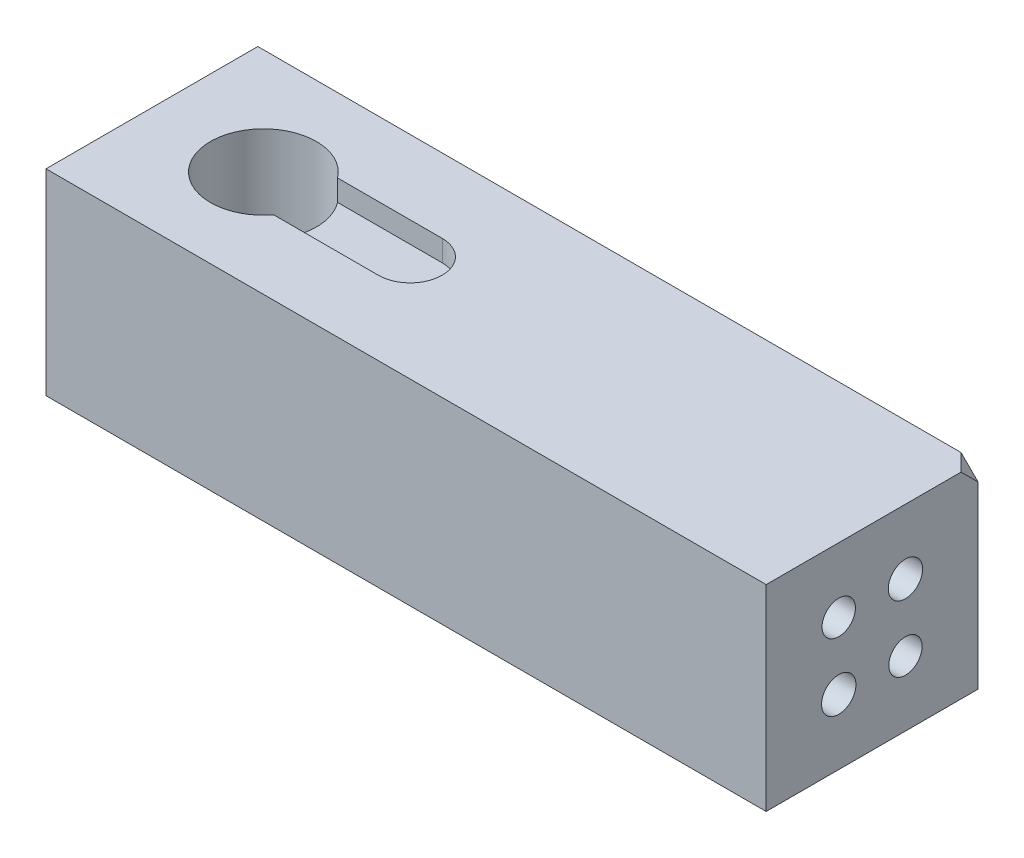
ISO-10303-21;
HEADER;
FILE_DESCRIPTION(('STEP AP214'),'2;1');
FILE_NAME('part.step','',(''),(''),'','','');
FILE_SCHEMA(('AUTOMOTIVE_DESIGN { 1 0 10303 214 1 1 1 1 }'));
ENDSEC;
DATA;
#1=APPLICATION_CONTEXT('core data for automotive mechanical design processes');
#2=APPLICATION_PROTOCOL_DEFINITION('international standard','automotive_design',2000,#1);
#3=PRODUCT_CONTEXT('',#1,'mechanical');
#4=PRODUCT('Part','Part','',(#3));
#5=PRODUCT_RELATED_PRODUCT_CATEGORY('part','',(#4));
#6=PRODUCT_DEFINITION_FORMATION('','',#4);
#7=PRODUCT_DEFINITION_CONTEXT('part definition',#1,'design');
#8=PRODUCT_DEFINITION('design','',#6,#7);
#9=PRODUCT_DEFINITION_SHAPE('','',#8);
#10=(LENGTH_UNIT() NAMED_UNIT(*) SI_UNIT(.MILLI.,.METRE.));
#11=(NAMED_UNIT(*) PLANE_ANGLE_UNIT() SI_UNIT($,.RADIAN.));
#12=(NAMED_UNIT(*) SI_UNIT($,.STERADIAN.) SOLID_ANGLE_UNIT());
#13=UNCERTAINTY_MEASURE_WITH_UNIT(LENGTH_MEASURE(1.E-05),#10,'distance_accuracy_value','');
#14=(GEOMETRIC_REPRESENTATION_CONTEXT(3) GLOBAL_UNCERTAINTY_ASSIGNED_CONTEXT((#13)) GLOBAL_UNIT_ASSIGNED_CONTEXT((#10,
#11,#12)) REPRESENTATION_CONTEXT('',''));
#15=CARTESIAN_POINT('',(0.,0.,0.));
#16=DIRECTION('',(0.,0.,1.));
#17=DIRECTION('',(1.,0.,0.));
#18=AXIS2_PLACEMENT_3D('',#15,#16,#17);
#19=CARTESIAN_POINT('',(0.,25.4,0.));
#20=DIRECTION('',(0.,1.,0.));
#21=DIRECTION('',(0.,0.,1.));
#22=AXIS2_PLACEMENT_3D('',#19,#20,#21);
#23=PLANE('',#22);
#24=DIRECTION('',(-1.,0.,-4.62106884082891E-13));
#25=VECTOR('',#24,1.);
#26=CARTESIAN_POINT('',(-33.9966063376731,25.4,-4.78790000000355));
#27=LINE('',#26,#25);
#28=CARTESIAN_POINT('',(-15.2356983518078,25.4,-4.78789999999488));
#29=VERTEX_POINT('',#28);
#30=CARTESIAN_POINT('',(-30.9323279661511,25.4,-4.78790000000214));
#31=VERTEX_POINT('',#30);
#32=EDGE_CURVE('E530',#29,#31,#27,.T.);
#33=ORIENTED_EDGE('',*,*,#32,.F.);
#34=CARTESIAN_POINT('',(-15.23569835181,25.4,-0.0253999999948824));
#35=DIRECTION('',(0.,1.,0.));
#36=DIRECTION('',(0.,0.,1.));
#37=AXIS2_PLACEMENT_3D('',#34,#35,#36);
#38=CIRCLE('',#37,4.7625);
#39=CARTESIAN_POINT('',(-10.47319835181,25.4,-0.0253999999948826));
#40=VERTEX_POINT('',#39);
#41=EDGE_CURVE('E391',#29,#40,#38,.F.);
#42=ORIENTED_EDGE('',*,*,#41,.T.);
#43=DIRECTION('',(0.,0.,-1.));
#44=VECTOR('',#43,1.);
#45=CARTESIAN_POINT('',(-10.47319835181,25.4,4.78789999999734));
#46=LINE('',#45,#44);
#47=CARTESIAN_POINT('',(-10.47319835181,25.4,0.025399999996005));
#48=VERTEX_POINT('',#47);
#49=EDGE_CURVE('E528',#48,#40,#46,.T.);
#50=ORIENTED_EDGE('',*,*,#49,.F.);
#51=CARTESIAN_POINT('',(-15.23569835181,25.4,0.025399999996005));
#52=DIRECTION('',(0.,1.,0.));
#53=DIRECTION('',(0.,0.,1.));
#54=AXIS2_PLACEMENT_3D('',#51,#52,#53);
#55=CIRCLE('',#54,4.7625);
#56=CARTESIAN_POINT('',(-15.2356983518114,25.4,4.787899999996));
#57=VERTEX_POINT('',#56);
#58=EDGE_CURVE('E522',#48,#57,#55,.F.);
#59=ORIENTED_EDGE('',*,*,#58,.T.);
#60=DIRECTION('',(1.,0.,2.79650172951439E-13));
#61=VECTOR('',#60,1.);
#62=CARTESIAN_POINT('',(-19.9981983518098,25.4,4.78789999999467));
#63=LINE('',#62,#61);
#64=CARTESIAN_POINT('',(-30.9323279661458,25.4,4.78789999999161));
#65=VERTEX_POINT('',#64);
#66=EDGE_CURVE('E536',#65,#57,#63,.T.);
#67=ORIENTED_EDGE('',*,*,#66,.F.);
#68=CARTESIAN_POINT('',(-37.2631983518087,25.4,-1.77635683940025E-12));
#69=DIRECTION('',(0.,1.,0.));
#70=DIRECTION('',(0.,0.,1.));
#71=AXIS2_PLACEMENT_3D('',#68,#69,#70);
#72=CIRCLE('',#71,7.9375);
#73=EDGE_CURVE('E567',#31,#65,#72,.T.);
#74=ORIENTED_EDGE('',*,*,#73,.F.);
#75=EDGE_LOOP('',(#33,#42,#50,#59,#67,#74));
#76=FACE_BOUND('',#75,.T.);
#77=DIRECTION('',(0.,0.,-1.));
#78=VECTOR('',#77,1.);
#79=CARTESIAN_POINT('',(53.975,25.4,-15.875));
#80=LINE('',#79,#78);
#81=CARTESIAN_POINT('',(53.975,25.4,15.875));
#82=VERTEX_POINT('',#81);
#83=CARTESIAN_POINT('',(53.975,25.4,-13.335));
#84=VERTEX_POINT('',#83);
#85=EDGE_CURVE('E472',#82,#84,#80,.T.);
#86=ORIENTED_EDGE('',*,*,#85,.T.);
#87=DIRECTION('',(-0.707106781186548,0.,-0.707106781186547));
#88=VECTOR('',#87,1.);
#89=CARTESIAN_POINT('',(33.655,25.4,-33.655));
#90=LINE('',#89,#88);
#91=CARTESIAN_POINT('',(51.435,25.4,-15.875));
#92=VERTEX_POINT('',#91);
#93=EDGE_CURVE('E66',#84,#92,#90,.T.);
#94=ORIENTED_EDGE('',*,*,#93,.T.);
#95=DIRECTION('',(-1.,0.,0.));
#96=VECTOR('',#95,1.);
#97=CARTESIAN_POINT('',(-53.975,25.4,-15.875));
#98=LINE('',#97,#96);
#99=CARTESIAN_POINT('',(-53.975,25.4,-15.875));
#100=VERTEX_POINT('',#99);
#101=EDGE_CURVE('E479',#92,#100,#98,.T.);
#102=ORIENTED_EDGE('',*,*,#101,.T.);
#103=DIRECTION('',(0.,0.,1.));
#104=VECTOR('',#103,1.);
#105=CARTESIAN_POINT('',(-53.975,25.4,-15.875));
#106=LINE('',#105,#104);
#107=CARTESIAN_POINT('',(-53.975,25.4,15.875));
#108=VERTEX_POINT('',#107);
#109=EDGE_CURVE('E483',#100,#108,#106,.T.);
#110=ORIENTED_EDGE('',*,*,#109,.T.);
#111=DIRECTION('',(1.,0.,0.));
#112=VECTOR('',#111,1.);
#113=CARTESIAN_POINT('',(-53.975,25.4,15.875));
#114=LINE('',#113,#112);
#115=EDGE_CURVE('E477',#108,#82,#114,.T.);
#116=ORIENTED_EDGE('',*,*,#115,.T.);
#117=EDGE_LOOP('',(#86,#94,#102,#110,#116));
#118=FACE_BOUND('',#117,.T.);
#119=ADVANCED_FACE('F370',(#76,#118),#23,.T.);
#120=CARTESIAN_POINT('',(-53.975,25.4,-15.875));
#121=DIRECTION('',(1.,0.,0.));
#122=DIRECTION('',(0.,0.,-1.));
#123=AXIS2_PLACEMENT_3D('',#120,#121,#122);
#124=PLANE('',#123);
#125=DIRECTION('',(0.,-1.,0.));
#126=VECTOR('',#125,1.);
#127=CARTESIAN_POINT('',(-53.975,25.4,-15.875));
#128=LINE('',#127,#126);
#129=CARTESIAN_POINT('',(-53.975,-4.05688234030898,-15.875));
#130=VERTEX_POINT('',#129);
#131=EDGE_CURVE('E481',#100,#130,#128,.T.);
#132=ORIENTED_EDGE('',*,*,#131,.T.);
#133=DIRECTION('',(0.,0.,1.));
#134=VECTOR('',#133,1.);
#135=CARTESIAN_POINT('',(-53.975,-4.05688234030898,-15.875));
#136=LINE('',#135,#134);
#137=CARTESIAN_POINT('',(-53.975,-4.05688234030898,15.875));
#138=VERTEX_POINT('',#137);
#139=EDGE_CURVE('E564',#130,#138,#136,.T.);
#140=ORIENTED_EDGE('',*,*,#139,.T.);
#141=DIRECTION('',(0.,-1.,0.));
#142=VECTOR('',#141,1.);
#143=CARTESIAN_POINT('',(-53.975,25.4,15.875));
#144=LINE('',#143,#142);
#145=EDGE_CURVE('E492',#108,#138,#144,.T.);
#146=ORIENTED_EDGE('',*,*,#145,.F.);
#147=ORIENTED_EDGE('',*,*,#109,.F.);
#148=EDGE_LOOP('',(#132,#140,#146,#147));
#149=FACE_BOUND('',#148,.T.);
#150=ADVANCED_FACE('F573',(#149),#124,.F.);
#151=CARTESIAN_POINT('',(-53.975,25.4,15.875));
#152=DIRECTION('',(0.,0.,-1.));
#153=DIRECTION('',(-1.,0.,0.));
#154=AXIS2_PLACEMENT_3D('',#151,#152,#153);
#155=PLANE('',#154);
#156=DIRECTION('',(1.,0.,0.));
#157=VECTOR('',#156,1.);
#158=CARTESIAN_POINT('',(-53.975,-4.05688234030898,15.875));
#159=LINE('',#158,#157);
#160=CARTESIAN_POINT('',(53.975,-4.05688234030898,15.875));
#161=VERTEX_POINT('',#160);
#162=EDGE_CURVE('E561',#138,#161,#159,.T.);
#163=ORIENTED_EDGE('',*,*,#162,.T.);
#164=DIRECTION('',(0.,-1.,0.));
#165=VECTOR('',#164,1.);
#166=CARTESIAN_POINT('',(53.975,25.4,15.875));
#167=LINE('',#166,#165);
#168=EDGE_CURVE('E490',#82,#161,#167,.T.);
#169=ORIENTED_EDGE('',*,*,#168,.F.);
#170=ORIENTED_EDGE('',*,*,#115,.F.);
#171=ORIENTED_EDGE('',*,*,#145,.T.);
#172=EDGE_LOOP('',(#163,#169,#170,#171));
#173=FACE_BOUND('',#172,.T.);
#174=ADVANCED_FACE('F575',(#173),#155,.F.);
#175=CARTESIAN_POINT('',(53.975,25.4,-15.875));
#176=DIRECTION('',(-1.,0.,0.));
#177=DIRECTION('',(0.,0.,1.));
#178=AXIS2_PLACEMENT_3D('',#175,#176,#177);
#179=PLANE('',#178);
#180=DIRECTION('',(0.,-0.707106781186548,-0.707106781186548));
#181=VECTOR('',#180,1.);
#182=CARTESIAN_POINT('',(53.975,24.13,-14.605));
#183=LINE('',#182,#181);
#184=CARTESIAN_POINT('',(53.975,22.86,-15.875));
#185=VERTEX_POINT('',#184);
#186=EDGE_CURVE('E463',#84,#185,#183,.T.);
#187=ORIENTED_EDGE('',*,*,#186,.F.);
#188=ORIENTED_EDGE('',*,*,#85,.F.);
#189=ORIENTED_EDGE('',*,*,#168,.T.);
#190=DIRECTION('',(0.,0.,1.));
#191=VECTOR('',#190,1.);
#192=CARTESIAN_POINT('',(53.975,-4.05688234030898,-15.875));
#193=LINE('',#192,#191);
#194=CARTESIAN_POINT('',(53.975,-4.05688234030898,-15.875));
#195=VERTEX_POINT('',#194);
#196=EDGE_CURVE('E500',#195,#161,#193,.T.);
#197=ORIENTED_EDGE('',*,*,#196,.F.);
#198=DIRECTION('',(0.,-1.,0.));
#199=VECTOR('',#198,1.);
#200=CARTESIAN_POINT('',(53.975,25.4,-15.875));
#201=LINE('',#200,#199);
#202=EDGE_CURVE('E474',#185,#195,#201,.T.);
#203=ORIENTED_EDGE('',*,*,#202,.F.);
#204=EDGE_LOOP('',(#187,#188,#189,#197,#203));
#205=FACE_BOUND('',#204,.T.);
#206=CARTESIAN_POINT('',(53.975,5.69982153438806,5.));
#207=DIRECTION('',(1.,0.,0.));
#208=DIRECTION('',(0.,0.,-1.));
#209=AXIS2_PLACEMENT_3D('',#206,#207,#208);
#210=CIRCLE('',#209,2.57649999999999);
#211=CARTESIAN_POINT('',(53.975,5.69982153438806,2.42350000000001));
#212=VERTEX_POINT('',#211);
#213=EDGE_CURVE('E841',#212,#212,#210,.T.);
#214=ORIENTED_EDGE('',*,*,#213,.F.);
#215=EDGE_LOOP('',(#214));
#216=FACE_BOUND('',#215,.T.);
#217=CARTESIAN_POINT('',(53.975,15.6998215343881,-5.));
#218=DIRECTION('',(1.,0.,0.));
#219=DIRECTION('',(0.,0.,-1.));
#220=AXIS2_PLACEMENT_3D('',#217,#218,#219);
#221=CIRCLE('',#220,2.57649999999999);
#222=CARTESIAN_POINT('',(53.975,15.6998215343881,-7.57649999999999));
#223=VERTEX_POINT('',#222);
#224=EDGE_CURVE('E835',#223,#223,#221,.T.);
#225=ORIENTED_EDGE('',*,*,#224,.F.);
#226=EDGE_LOOP('',(#225));
#227=FACE_BOUND('',#226,.T.);
#228=CARTESIAN_POINT('',(53.975,15.6998215343881,5.));
#229=DIRECTION('',(1.,0.,0.));
#230=DIRECTION('',(0.,0.,-1.));
#231=AXIS2_PLACEMENT_3D('',#228,#229,#230);
#232=CIRCLE('',#231,2.49999999999999);
#233=CARTESIAN_POINT('',(53.975,15.6998215343881,2.50000000000001));
#234=VERTEX_POINT('',#233);
#235=EDGE_CURVE('E829',#234,#234,#232,.T.);
#236=ORIENTED_EDGE('',*,*,#235,.F.);
#237=EDGE_LOOP('',(#236));
#238=FACE_BOUND('',#237,.T.);
#239=CARTESIAN_POINT('',(53.975,5.69982153438806,-5.));
#240=DIRECTION('',(1.,0.,0.));
#241=DIRECTION('',(0.,0.,-1.));
#242=AXIS2_PLACEMENT_3D('',#239,#240,#241);
#243=CIRCLE('',#242,2.49999999999999);
#244=CARTESIAN_POINT('',(53.975,5.69982153438806,-7.49999999999999));
#245=VERTEX_POINT('',#244);
#246=EDGE_CURVE('E823',#245,#245,#243,.T.);
#247=ORIENTED_EDGE('',*,*,#246,.F.);
#248=EDGE_LOOP('',(#247));
#249=FACE_BOUND('',#248,.T.);
#250=ADVANCED_FACE('F470',(#205,#216,#227,#238,#249),#179,.F.);
#251=CARTESIAN_POINT('',(-53.975,25.4,-15.875));
#252=DIRECTION('',(0.,0.,1.));
#253=DIRECTION('',(1.,0.,0.));
#254=AXIS2_PLACEMENT_3D('',#251,#252,#253);
#255=PLANE('',#254);
#256=DIRECTION('',(-0.707106781186548,0.707106781186547,0.));
#257=VECTOR('',#256,1.);
#258=CARTESIAN_POINT('',(-1.27000000000006,78.105,-15.875));
#259=LINE('',#258,#257);
#260=EDGE_CURVE('E378',#185,#92,#259,.T.);
#261=ORIENTED_EDGE('',*,*,#260,.F.);
#262=ORIENTED_EDGE('',*,*,#202,.T.);
#263=DIRECTION('',(-1.,0.,0.));
#264=VECTOR('',#263,1.);
#265=CARTESIAN_POINT('',(-53.975,-4.05688234030898,-15.875));
#266=LINE('',#265,#264);
#267=EDGE_CURVE('E499',#195,#130,#266,.T.);
#268=ORIENTED_EDGE('',*,*,#267,.T.);
#269=ORIENTED_EDGE('',*,*,#131,.F.);
#270=ORIENTED_EDGE('',*,*,#101,.F.);
#271=EDGE_LOOP('',(#261,#262,#268,#269,#270));
#272=FACE_BOUND('',#271,.T.);
#273=ADVANCED_FACE('F580',(#272),#255,.F.);
#274=CARTESIAN_POINT('',(-37.2631983518087,-12.7,-1.77635683940025E-12));
#275=DIRECTION('',(0.,1.,0.));
#276=DIRECTION('',(0.,0.,1.));
#277=AXIS2_PLACEMENT_3D('',#274,#275,#276);
#278=CYLINDRICAL_SURFACE('',#277,7.9375);
#279=CARTESIAN_POINT('',(-37.2631983518087,-4.05688234030898,-1.77635683940025E-12));
#280=DIRECTION('',(0.,1.,0.));
#281=DIRECTION('',(0.,0.,1.));
#282=AXIS2_PLACEMENT_3D('',#279,#280,#281);
#283=CIRCLE('',#282,7.9375);
#284=CARTESIAN_POINT('',(-37.2631983518087,-4.05688234030898,7.93749999999823));
#285=VERTEX_POINT('',#284);
#286=EDGE_CURVE('E496',#285,#285,#283,.F.);
#287=ORIENTED_EDGE('',*,*,#286,.T.);
#288=EDGE_LOOP('',(#287));
#289=FACE_BOUND('',#288,.T.);
#290=CARTESIAN_POINT('',(-37.2631983518087,22.2250000000039,-1.77635683940025E-12));
#291=DIRECTION('',(0.,-1.,0.));
#292=DIRECTION('',(0.,0.,-1.));
#293=AXIS2_PLACEMENT_3D('',#290,#291,#292);
#294=CIRCLE('',#293,7.9375);
#295=CARTESIAN_POINT('',(-30.9323279661501,22.2250000000039,4.78789999999734));
#296=VERTEX_POINT('',#295);
#297=CARTESIAN_POINT('',(-30.9323279661522,22.2250000000039,-4.78790000000356));
#298=VERTEX_POINT('',#297);
#299=EDGE_CURVE('E495',#296,#298,#294,.F.);
#300=ORIENTED_EDGE('',*,*,#299,.T.);
#301=DIRECTION('',(0.,1.,0.));
#302=VECTOR('',#301,1.);
#303=CARTESIAN_POINT('',(-30.9323279661511,-12.7,-4.78790000000214));
#304=LINE('',#303,#302);
#305=EDGE_CURVE('E506',#298,#31,#304,.T.);
#306=ORIENTED_EDGE('',*,*,#305,.T.);
#307=ORIENTED_EDGE('',*,*,#73,.T.);
#308=DIRECTION('',(0.,1.,0.));
#309=VECTOR('',#308,1.);
#310=CARTESIAN_POINT('',(-30.9323279661458,-12.7,4.78789999999161));
#311=LINE('',#310,#309);
#312=EDGE_CURVE('E503',#65,#296,#311,.F.);
#313=ORIENTED_EDGE('',*,*,#312,.T.);
#314=EDGE_LOOP('',(#300,#306,#307,#313));
#315=FACE_BOUND('',#314,.T.);
#316=ADVANCED_FACE('F582',(#289,#315),#278,.F.);
#317=CARTESIAN_POINT('',(39.8215832278428,-4.05688234030899,71.6580714500799));
#318=DIRECTION('',(0.,1.,0.));
#319=DIRECTION('',(0.,0.,1.));
#320=AXIS2_PLACEMENT_3D('',#317,#318,#319);
#321=PLANE('',#320);
#322=ORIENTED_EDGE('',*,*,#286,.F.);
#323=EDGE_LOOP('',(#322));
#324=FACE_BOUND('',#323,.T.);
#325=ORIENTED_EDGE('',*,*,#139,.F.);
#326=ORIENTED_EDGE('',*,*,#267,.F.);
#327=ORIENTED_EDGE('',*,*,#196,.T.);
#328=ORIENTED_EDGE('',*,*,#162,.F.);
#329=EDGE_LOOP('',(#325,#326,#327,#328));
#330=FACE_BOUND('',#329,.T.);
#331=ADVANCED_FACE('F578',(#324,#330),#321,.F.);
#332=CARTESIAN_POINT('',(-33.9966063376731,22.2250000000039,-4.78790000000355));
#333=DIRECTION('',(4.62106884082891E-13,0.,-1.));
#334=DIRECTION('',(-1.,0.,-4.62106884082891E-13));
#335=AXIS2_PLACEMENT_3D('',#332,#333,#334);
#336=PLANE('',#335);
#337=DIRECTION('',(-1.,0.,0.));
#338=VECTOR('',#337,1.);
#339=CARTESIAN_POINT('',(-19.99819835181,22.2250000000039,-4.78790000000355));
#340=LINE('',#339,#338);
#341=CARTESIAN_POINT('',(-15.2356983518078,22.2250000000039,-4.78790000000355));
#342=VERTEX_POINT('',#341);
#343=EDGE_CURVE('E543',#342,#298,#340,.T.);
#344=ORIENTED_EDGE('',*,*,#343,.F.);
#345=DIRECTION('',(0.,1.,0.));
#346=VECTOR('',#345,1.);
#347=CARTESIAN_POINT('',(-15.2356983518078,25.4,-4.78789999999488));
#348=LINE('',#347,#346);
#349=EDGE_CURVE('E520',#342,#29,#348,.T.);
#350=ORIENTED_EDGE('',*,*,#349,.T.);
#351=ORIENTED_EDGE('',*,*,#32,.T.);
#352=ORIENTED_EDGE('',*,*,#305,.F.);
#353=EDGE_LOOP('',(#344,#350,#351,#352));
#354=FACE_BOUND('',#353,.T.);
#355=ADVANCED_FACE('F547',(#354),#336,.F.);
#356=CARTESIAN_POINT('',(-19.9981983518098,22.2250000000039,4.78789999999467));
#357=DIRECTION('',(-2.79650172951439E-13,0.,1.));
#358=DIRECTION('',(1.,0.,2.79650172951439E-13));
#359=AXIS2_PLACEMENT_3D('',#356,#357,#358);
#360=PLANE('',#359);
#361=ORIENTED_EDGE('',*,*,#66,.T.);
#362=DIRECTION('',(0.,1.,0.));
#363=VECTOR('',#362,1.);
#364=CARTESIAN_POINT('',(-15.2356983518114,22.2250000000039,4.787899999996));
#365=LINE('',#364,#363);
#366=CARTESIAN_POINT('',(-15.2356983518114,22.2250000000039,4.78789999999733));
#367=VERTEX_POINT('',#366);
#368=EDGE_CURVE('E514',#57,#367,#365,.F.);
#369=ORIENTED_EDGE('',*,*,#368,.T.);
#370=DIRECTION('',(1.,0.,0.));
#371=VECTOR('',#370,1.);
#372=CARTESIAN_POINT('',(-30.1581983518095,22.2250000000039,4.78789999999734));
#373=LINE('',#372,#371);
#374=EDGE_CURVE('E551',#296,#367,#373,.T.);
#375=ORIENTED_EDGE('',*,*,#374,.F.);
#376=ORIENTED_EDGE('',*,*,#312,.F.);
#377=EDGE_LOOP('',(#361,#369,#375,#376));
#378=FACE_BOUND('',#377,.T.);
#379=ADVANCED_FACE('F601',(#378),#360,.F.);
#380=CARTESIAN_POINT('',(0.,22.2250000000039,0.));
#381=DIRECTION('',(0.,-1.,0.));
#382=DIRECTION('',(0.,0.,-1.));
#383=AXIS2_PLACEMENT_3D('',#380,#381,#382);
#384=PLANE('',#383);
#385=ORIENTED_EDGE('',*,*,#374,.T.);
#386=CARTESIAN_POINT('',(-15.23569835181,22.2250000000039,0.025399999996005));
#387=DIRECTION('',(0.,-1.,0.));
#388=DIRECTION('',(0.,0.,-1.));
#389=AXIS2_PLACEMENT_3D('',#386,#387,#388);
#390=CIRCLE('',#389,4.7625);
#391=CARTESIAN_POINT('',(-10.47319835181,22.2250000000039,0.025399999996005));
#392=VERTEX_POINT('',#391);
#393=EDGE_CURVE('E518',#367,#392,#390,.F.);
#394=ORIENTED_EDGE('',*,*,#393,.T.);
#395=DIRECTION('',(0.,0.,-1.));
#396=VECTOR('',#395,1.);
#397=CARTESIAN_POINT('',(-10.47319835181,22.2250000000039,4.78789999999734));
#398=LINE('',#397,#396);
#399=CARTESIAN_POINT('',(-10.47319835181,22.2250000000039,-0.0253999999948826));
#400=VERTEX_POINT('',#399);
#401=EDGE_CURVE('E545',#392,#400,#398,.T.);
#402=ORIENTED_EDGE('',*,*,#401,.T.);
#403=CARTESIAN_POINT('',(-15.23569835181,22.2250000000039,-0.0253999999948824));
#404=DIRECTION('',(0.,-1.,0.));
#405=DIRECTION('',(0.,0.,-1.));
#406=AXIS2_PLACEMENT_3D('',#403,#404,#405);
#407=CIRCLE('',#406,4.7625);
#408=EDGE_CURVE('E516',#400,#342,#407,.F.);
#409=ORIENTED_EDGE('',*,*,#408,.T.);
#410=ORIENTED_EDGE('',*,*,#343,.T.);
#411=ORIENTED_EDGE('',*,*,#299,.F.);
#412=EDGE_LOOP('',(#385,#394,#402,#409,#410,#411));
#413=FACE_BOUND('',#412,.T.);
#414=ADVANCED_FACE('F542',(#413),#384,.F.);
#415=CARTESIAN_POINT('',(-10.47319835181,22.2250000000039,4.78789999999734));
#416=DIRECTION('',(1.,0.,0.));
#417=DIRECTION('',(0.,0.,-1.));
#418=AXIS2_PLACEMENT_3D('',#415,#416,#417);
#419=PLANE('',#418);
#420=ORIENTED_EDGE('',*,*,#401,.F.);
#421=DIRECTION('',(0.,1.,0.));
#422=VECTOR('',#421,1.);
#423=CARTESIAN_POINT('',(-10.47319835181,25.4,0.025399999996005));
#424=LINE('',#423,#422);
#425=EDGE_CURVE('E511',#392,#48,#424,.T.);
#426=ORIENTED_EDGE('',*,*,#425,.T.);
#427=ORIENTED_EDGE('',*,*,#49,.T.);
#428=DIRECTION('',(0.,1.,0.));
#429=VECTOR('',#428,1.);
#430=CARTESIAN_POINT('',(-10.47319835181,22.2250000000039,-0.0253999999948824));
#431=LINE('',#430,#429);
#432=EDGE_CURVE('E509',#40,#400,#431,.F.);
#433=ORIENTED_EDGE('',*,*,#432,.T.);
#434=EDGE_LOOP('',(#420,#426,#427,#433));
#435=FACE_BOUND('',#434,.T.);
#436=ADVANCED_FACE('F533',(#435),#419,.F.);
#437=CARTESIAN_POINT('',(-15.23569835181,22.2250000000039,0.025399999996005));
#438=DIRECTION('',(0.,-1.,0.));
#439=DIRECTION('',(0.,0.,-1.));
#440=AXIS2_PLACEMENT_3D('',#437,#438,#439);
#441=CYLINDRICAL_SURFACE('',#440,4.7625);
#442=ORIENTED_EDGE('',*,*,#393,.F.);
#443=ORIENTED_EDGE('',*,*,#368,.F.);
#444=ORIENTED_EDGE('',*,*,#58,.F.);
#445=ORIENTED_EDGE('',*,*,#425,.F.);
#446=EDGE_LOOP('',(#442,#443,#444,#445));
#447=FACE_BOUND('',#446,.T.);
#448=ADVANCED_FACE('F607',(#447),#441,.F.);
#449=CARTESIAN_POINT('',(-15.23569835181,22.2250000000039,-0.0253999999948824));
#450=DIRECTION('',(0.,-1.,0.));
#451=DIRECTION('',(0.,0.,-1.));
#452=AXIS2_PLACEMENT_3D('',#449,#450,#451);
#453=CYLINDRICAL_SURFACE('',#452,4.7625);
#454=ORIENTED_EDGE('',*,*,#408,.F.);
#455=ORIENTED_EDGE('',*,*,#432,.F.);
#456=ORIENTED_EDGE('',*,*,#41,.F.);
#457=ORIENTED_EDGE('',*,*,#349,.F.);
#458=EDGE_LOOP('',(#454,#455,#456,#457));
#459=FACE_BOUND('',#458,.T.);
#460=ADVANCED_FACE('F372',(#459),#453,.F.);
#461=CARTESIAN_POINT('',(38.9636,5.69982153438806,-5.));
#462=DIRECTION('',(1.,0.,0.));
#463=DIRECTION('',(0.,0.,-1.));
#464=AXIS2_PLACEMENT_3D('',#461,#462,#463);
#465=CONICAL_SURFACE('',#464,2.5,1.02974425867665);
#466=CARTESIAN_POINT('',(37.4614484524311,5.69982153438805,-5.));
#467=VERTEX_POINT('',#466);
#468=VERTEX_LOOP('',#467);
#469=FACE_BOUND('',#468,.T.);
#470=CARTESIAN_POINT('',(38.9636,5.69982153438806,-5.));
#471=DIRECTION('',(1.,0.,0.));
#472=DIRECTION('',(0.,0.,-1.));
#473=AXIS2_PLACEMENT_3D('',#470,#471,#472);
#474=CIRCLE('',#473,2.5);
#475=CARTESIAN_POINT('',(38.9636,5.69982153438806,-7.5));
#476=VERTEX_POINT('',#475);
#477=EDGE_CURVE('E556',#476,#476,#474,.T.);
#478=ORIENTED_EDGE('',*,*,#477,.T.);
#479=EDGE_LOOP('',(#478));
#480=FACE_BOUND('',#479,.T.);
#481=ADVANCED_FACE('F612',(#469,#480),#465,.F.);
#482=CARTESIAN_POINT('',(53.975,5.69982153438806,-5.));
#483=DIRECTION('',(1.,0.,0.));
#484=DIRECTION('',(0.,0.,-1.));
#485=AXIS2_PLACEMENT_3D('',#482,#483,#484);
#486=CYLINDRICAL_SURFACE('',#485,2.49999999999999);
#487=ORIENTED_EDGE('',*,*,#477,.F.);
#488=EDGE_LOOP('',(#487));
#489=FACE_BOUND('',#488,.T.);
#490=ORIENTED_EDGE('',*,*,#246,.T.);
#491=EDGE_LOOP('',(#490));
#492=FACE_BOUND('',#491,.T.);
#493=ADVANCED_FACE('F615',(#489,#492),#486,.F.);
#494=CARTESIAN_POINT('',(38.9636,15.6998215343881,5.));
#495=DIRECTION('',(1.,0.,0.));
#496=DIRECTION('',(0.,0.,-1.));
#497=AXIS2_PLACEMENT_3D('',#494,#495,#496);
#498=CONICAL_SURFACE('',#497,2.5,1.02974425867665);
#499=CARTESIAN_POINT('',(37.4614484524311,15.6998215343881,5.));
#500=VERTEX_POINT('',#499);
#501=VERTEX_LOOP('',#500);
#502=FACE_BOUND('',#501,.T.);
#503=CARTESIAN_POINT('',(38.9636,15.6998215343881,5.));
#504=DIRECTION('',(1.,0.,0.));
#505=DIRECTION('',(0.,0.,-1.));
#506=AXIS2_PLACEMENT_3D('',#503,#504,#505);
#507=CIRCLE('',#506,2.5);
#508=CARTESIAN_POINT('',(38.9636,15.6998215343881,2.50000000000001));
#509=VERTEX_POINT('',#508);
#510=EDGE_CURVE('E826',#509,#509,#507,.T.);
#511=ORIENTED_EDGE('',*,*,#510,.T.);
#512=EDGE_LOOP('',(#511));
#513=FACE_BOUND('',#512,.T.);
#514=ADVANCED_FACE('F619',(#502,#513),#498,.F.);
#515=CARTESIAN_POINT('',(53.975,15.6998215343881,5.));
#516=DIRECTION('',(1.,0.,0.));
#517=DIRECTION('',(0.,0.,-1.));
#518=AXIS2_PLACEMENT_3D('',#515,#516,#517);
#519=CYLINDRICAL_SURFACE('',#518,2.49999999999999);
#520=ORIENTED_EDGE('',*,*,#510,.F.);
#521=EDGE_LOOP('',(#520));
#522=FACE_BOUND('',#521,.T.);
#523=ORIENTED_EDGE('',*,*,#235,.T.);
#524=EDGE_LOOP('',(#523));
#525=FACE_BOUND('',#524,.T.);
#526=ADVANCED_FACE('F623',(#522,#525),#519,.F.);
#527=CARTESIAN_POINT('',(23.5712,15.6998215343881,-5.));
#528=DIRECTION('',(1.,0.,0.));
#529=DIRECTION('',(0.,0.,-1.));
#530=AXIS2_PLACEMENT_3D('',#527,#528,#529);
#531=CONICAL_SURFACE('',#530,2.5765,1.02974425867665);
#532=CARTESIAN_POINT('',(22.0230826150755,15.6998215343881,-5.));
#533=VERTEX_POINT('',#532);
#534=VERTEX_LOOP('',#533);
#535=FACE_BOUND('',#534,.T.);
#536=CARTESIAN_POINT('',(23.5712,15.6998215343881,-5.));
#537=DIRECTION('',(1.,0.,0.));
#538=DIRECTION('',(0.,0.,-1.));
#539=AXIS2_PLACEMENT_3D('',#536,#537,#538);
#540=CIRCLE('',#539,2.5765);
#541=CARTESIAN_POINT('',(23.5712,15.6998215343881,-7.57649999999999));
#542=VERTEX_POINT('',#541);
#543=EDGE_CURVE('E832',#542,#542,#540,.T.);
#544=ORIENTED_EDGE('',*,*,#543,.T.);
#545=EDGE_LOOP('',(#544));
#546=FACE_BOUND('',#545,.T.);
#547=ADVANCED_FACE('F627',(#535,#546),#531,.F.);
#548=CARTESIAN_POINT('',(53.975,15.6998215343881,-5.));
#549=DIRECTION('',(1.,0.,0.));
#550=DIRECTION('',(0.,0.,-1.));
#551=AXIS2_PLACEMENT_3D('',#548,#549,#550);
#552=CYLINDRICAL_SURFACE('',#551,2.57649999999999);
#553=ORIENTED_EDGE('',*,*,#543,.F.);
#554=EDGE_LOOP('',(#553));
#555=FACE_BOUND('',#554,.T.);
#556=ORIENTED_EDGE('',*,*,#224,.T.);
#557=EDGE_LOOP('',(#556));
#558=FACE_BOUND('',#557,.T.);
#559=ADVANCED_FACE('F631',(#555,#558),#552,.F.);
#560=CARTESIAN_POINT('',(23.5712,5.69982153438806,5.));
#561=DIRECTION('',(1.,0.,0.));
#562=DIRECTION('',(0.,0.,-1.));
#563=AXIS2_PLACEMENT_3D('',#560,#561,#562);
#564=CONICAL_SURFACE('',#563,2.5765,1.02974425867665);
#565=CARTESIAN_POINT('',(22.0230826150755,5.69982153438805,5.));
#566=VERTEX_POINT('',#565);
#567=VERTEX_LOOP('',#566);
#568=FACE_BOUND('',#567,.T.);
#569=CARTESIAN_POINT('',(23.5712,5.69982153438806,5.));
#570=DIRECTION('',(1.,0.,0.));
#571=DIRECTION('',(0.,0.,-1.));
#572=AXIS2_PLACEMENT_3D('',#569,#570,#571);
#573=CIRCLE('',#572,2.5765);
#574=CARTESIAN_POINT('',(23.5712,5.69982153438806,2.42350000000001));
#575=VERTEX_POINT('',#574);
#576=EDGE_CURVE('E838',#575,#575,#573,.T.);
#577=ORIENTED_EDGE('',*,*,#576,.T.);
#578=EDGE_LOOP('',(#577));
#579=FACE_BOUND('',#578,.T.);
#580=ADVANCED_FACE('F635',(#568,#579),#564,.F.);
#581=CARTESIAN_POINT('',(53.975,5.69982153438806,5.));
#582=DIRECTION('',(1.,0.,0.));
#583=DIRECTION('',(0.,0.,-1.));
#584=AXIS2_PLACEMENT_3D('',#581,#582,#583);
#585=CYLINDRICAL_SURFACE('',#584,2.57649999999999);
#586=ORIENTED_EDGE('',*,*,#576,.F.);
#587=EDGE_LOOP('',(#586));
#588=FACE_BOUND('',#587,.T.);
#589=ORIENTED_EDGE('',*,*,#213,.T.);
#590=EDGE_LOOP('',(#589));
#591=FACE_BOUND('',#590,.T.);
#592=ADVANCED_FACE('F639',(#588,#591),#585,.F.);
#593=CARTESIAN_POINT('',(30.9033333333333,30.9033333333333,-30.9033333333333));
#594=DIRECTION('',(0.577350269189625,0.577350269189626,-0.577350269189626));
#595=DIRECTION('',(0.,0.707106781186548,0.707106781186548));
#596=AXIS2_PLACEMENT_3D('',#593,#594,#595);
#597=PLANE('',#596);
#598=ORIENTED_EDGE('',*,*,#93,.F.);
#599=ORIENTED_EDGE('',*,*,#186,.T.);
#600=ORIENTED_EDGE('',*,*,#260,.T.);
#601=EDGE_LOOP('',(#598,#599,#600));
#602=FACE_BOUND('',#601,.T.);
#603=ADVANCED_FACE('F462',(#602),#597,.T.);
#604=CLOSED_SHELL('',(#119,#150,#174,#250,#273,#316,#331,#355,#379,#414,#436,#448,#460,#481,
#493,#514,#526,#547,#559,#580,#592,#603));
#605=MANIFOLD_SOLID_BREP('B8',#604);
#606=ADVANCED_BREP_SHAPE_REPRESENTATION('',(#18,#605),#14);
#607=SHAPE_DEFINITION_REPRESENTATION(#9,#606);
ENDSEC;
END-ISO-10303-21;
